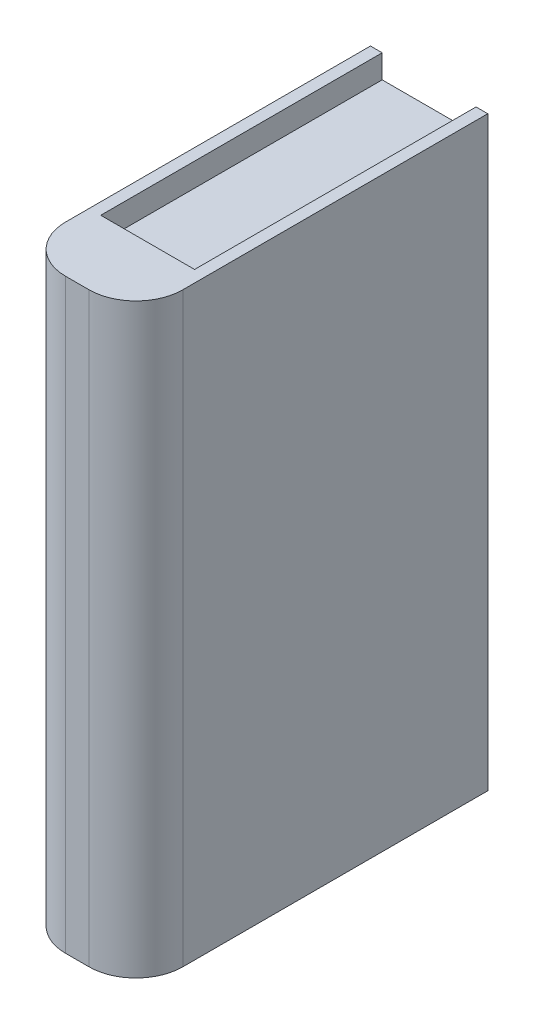
ISO-10303-21;
HEADER;
FILE_DESCRIPTION(('STEP AP214'),'2;1');
FILE_NAME('part.step','',(''),(''),'','','');
FILE_SCHEMA(('AUTOMOTIVE_DESIGN { 1 0 10303 214 1 1 1 1 }'));
ENDSEC;
DATA;
#1=APPLICATION_CONTEXT('core data for automotive mechanical design processes');
#2=APPLICATION_PROTOCOL_DEFINITION('international standard','automotive_design',2000,#1);
#3=PRODUCT_CONTEXT('',#1,'mechanical');
#4=PRODUCT('Part','Part','',(#3));
#5=PRODUCT_RELATED_PRODUCT_CATEGORY('part','',(#4));
#6=PRODUCT_DEFINITION_FORMATION('','',#4);
#7=PRODUCT_DEFINITION_CONTEXT('part definition',#1,'design');
#8=PRODUCT_DEFINITION('design','',#6,#7);
#9=PRODUCT_DEFINITION_SHAPE('','',#8);
#10=(LENGTH_UNIT() NAMED_UNIT(*) SI_UNIT(.MILLI.,.METRE.));
#11=(NAMED_UNIT(*) PLANE_ANGLE_UNIT() SI_UNIT($,.RADIAN.));
#12=(NAMED_UNIT(*) SI_UNIT($,.STERADIAN.) SOLID_ANGLE_UNIT());
#13=UNCERTAINTY_MEASURE_WITH_UNIT(LENGTH_MEASURE(1.E-05),#10,'distance_accuracy_value','');
#14=(GEOMETRIC_REPRESENTATION_CONTEXT(3) GLOBAL_UNCERTAINTY_ASSIGNED_CONTEXT((#13)) GLOBAL_UNIT_ASSIGNED_CONTEXT((#10,
#11,#12)) REPRESENTATION_CONTEXT('',''));
#15=CARTESIAN_POINT('',(0.,0.,0.));
#16=DIRECTION('',(0.,0.,1.));
#17=DIRECTION('',(1.,0.,0.));
#18=AXIS2_PLACEMENT_3D('',#15,#16,#17);
#19=CARTESIAN_POINT('',(5.,0.,0.));
#20=DIRECTION('',(0.,0.,1.));
#21=DIRECTION('',(1.,0.,0.));
#22=AXIS2_PLACEMENT_3D('',#19,#20,#21);
#23=PLANE('',#22);
#24=DIRECTION('',(-1.,0.,0.));
#25=VECTOR('',#24,1.);
#26=CARTESIAN_POINT('',(5.,25.,0.));
#27=LINE('',#26,#25);
#28=CARTESIAN_POINT('',(0.5,25.,0.));
#29=VERTEX_POINT('',#28);
#30=CARTESIAN_POINT('',(0.,25.,0.));
#31=VERTEX_POINT('',#30);
#32=EDGE_CURVE('E169',#29,#31,#27,.T.);
#33=ORIENTED_EDGE('',*,*,#32,.F.);
#34=DIRECTION('',(0.,1.,0.));
#35=VECTOR('',#34,1.);
#36=CARTESIAN_POINT('',(0.5,24.,0.));
#37=LINE('',#36,#35);
#38=CARTESIAN_POINT('',(0.5,24.,0.));
#39=VERTEX_POINT('',#38);
#40=EDGE_CURVE('E139',#39,#29,#37,.T.);
#41=ORIENTED_EDGE('',*,*,#40,.F.);
#42=DIRECTION('',(-1.,0.,0.));
#43=VECTOR('',#42,1.);
#44=CARTESIAN_POINT('',(0.5,24.,0.));
#45=LINE('',#44,#43);
#46=CARTESIAN_POINT('',(4.5,24.,0.));
#47=VERTEX_POINT('',#46);
#48=EDGE_CURVE('E117',#47,#39,#45,.T.);
#49=ORIENTED_EDGE('',*,*,#48,.F.);
#50=DIRECTION('',(0.,1.,0.));
#51=VECTOR('',#50,1.);
#52=CARTESIAN_POINT('',(4.5,24.,0.));
#53=LINE('',#52,#51);
#54=CARTESIAN_POINT('',(4.5,25.,0.));
#55=VERTEX_POINT('',#54);
#56=EDGE_CURVE('E142',#47,#55,#53,.T.);
#57=ORIENTED_EDGE('',*,*,#56,.T.);
#58=CARTESIAN_POINT('',(5.,25.,0.));
#59=VERTEX_POINT('',#58);
#60=EDGE_CURVE('E170',#59,#55,#27,.T.);
#61=ORIENTED_EDGE('',*,*,#60,.F.);
#62=DIRECTION('',(0.,1.,0.));
#63=VECTOR('',#62,1.);
#64=CARTESIAN_POINT('',(5.,0.,0.));
#65=LINE('',#64,#63);
#66=CARTESIAN_POINT('',(5.,0.,0.));
#67=VERTEX_POINT('',#66);
#68=EDGE_CURVE('E146',#67,#59,#65,.T.);
#69=ORIENTED_EDGE('',*,*,#68,.F.);
#70=DIRECTION('',(-1.,0.,0.));
#71=VECTOR('',#70,1.);
#72=CARTESIAN_POINT('',(5.,0.,0.));
#73=LINE('',#72,#71);
#74=CARTESIAN_POINT('',(0.,0.,0.));
#75=VERTEX_POINT('',#74);
#76=EDGE_CURVE('E155',#67,#75,#73,.T.);
#77=ORIENTED_EDGE('',*,*,#76,.T.);
#78=DIRECTION('',(0.,1.,0.));
#79=VECTOR('',#78,1.);
#80=CARTESIAN_POINT('',(0.,0.,0.));
#81=LINE('',#80,#79);
#82=EDGE_CURVE('E141',#75,#31,#81,.T.);
#83=ORIENTED_EDGE('',*,*,#82,.T.);
#84=EDGE_LOOP('',(#33,#41,#49,#57,#61,#69,#77,#83));
#85=FACE_BOUND('',#84,.T.);
#86=ADVANCED_FACE('F33',(#85),#23,.F.);
#87=CARTESIAN_POINT('',(5.,25.,0.));
#88=DIRECTION('',(0.,-1.,0.));
#89=DIRECTION('',(0.,0.,-1.));
#90=AXIS2_PLACEMENT_3D('',#87,#88,#89);
#91=PLANE('',#90);
#92=DIRECTION('',(1.,0.,0.));
#93=VECTOR('',#92,1.);
#94=CARTESIAN_POINT('',(0.500000000000002,25.,12.));
#95=LINE('',#94,#93);
#96=CARTESIAN_POINT('',(0.500000000000001,25.,12.));
#97=VERTEX_POINT('',#96);
#98=CARTESIAN_POINT('',(4.5,25.,12.));
#99=VERTEX_POINT('',#98);
#100=EDGE_CURVE('E132',#97,#99,#95,.T.);
#101=ORIENTED_EDGE('',*,*,#100,.F.);
#102=DIRECTION('',(0.,0.,1.));
#103=VECTOR('',#102,1.);
#104=CARTESIAN_POINT('',(0.5,25.,0.));
#105=LINE('',#104,#103);
#106=EDGE_CURVE('E48',#29,#97,#105,.T.);
#107=ORIENTED_EDGE('',*,*,#106,.F.);
#108=ORIENTED_EDGE('',*,*,#32,.T.);
#109=DIRECTION('',(0.,0.,1.));
#110=VECTOR('',#109,1.);
#111=CARTESIAN_POINT('',(0.,25.,0.));
#112=LINE('',#111,#110);
#113=CARTESIAN_POINT('',(0.,25.,13.));
#114=VERTEX_POINT('',#113);
#115=EDGE_CURVE('E158',#31,#114,#112,.T.);
#116=ORIENTED_EDGE('',*,*,#115,.T.);
#117=CARTESIAN_POINT('',(2.,25.,13.));
#118=DIRECTION('',(0.,-1.,0.));
#119=DIRECTION('',(0.,0.,-1.));
#120=AXIS2_PLACEMENT_3D('',#117,#118,#119);
#121=CIRCLE('',#120,2.);
#122=CARTESIAN_POINT('',(2.,25.,15.));
#123=VERTEX_POINT('',#122);
#124=EDGE_CURVE('E185',#114,#123,#121,.F.);
#125=ORIENTED_EDGE('',*,*,#124,.T.);
#126=DIRECTION('',(-1.,0.,0.));
#127=VECTOR('',#126,1.);
#128=CARTESIAN_POINT('',(5.,25.,15.));
#129=LINE('',#128,#127);
#130=CARTESIAN_POINT('',(3.,25.,15.));
#131=VERTEX_POINT('',#130);
#132=EDGE_CURVE('E166',#131,#123,#129,.T.);
#133=ORIENTED_EDGE('',*,*,#132,.F.);
#134=CARTESIAN_POINT('',(3.,25.,13.));
#135=DIRECTION('',(0.,-1.,0.));
#136=DIRECTION('',(0.,0.,-1.));
#137=AXIS2_PLACEMENT_3D('',#134,#135,#136);
#138=CIRCLE('',#137,2.);
#139=CARTESIAN_POINT('',(5.,25.,13.));
#140=VERTEX_POINT('',#139);
#141=EDGE_CURVE('E41',#131,#140,#138,.F.);
#142=ORIENTED_EDGE('',*,*,#141,.T.);
#143=DIRECTION('',(0.,0.,1.));
#144=VECTOR('',#143,1.);
#145=CARTESIAN_POINT('',(5.,25.,0.));
#146=LINE('',#145,#144);
#147=EDGE_CURVE('E149',#59,#140,#146,.T.);
#148=ORIENTED_EDGE('',*,*,#147,.F.);
#149=ORIENTED_EDGE('',*,*,#60,.T.);
#150=DIRECTION('',(0.,0.,-1.));
#151=VECTOR('',#150,1.);
#152=CARTESIAN_POINT('',(4.5,25.,0.));
#153=LINE('',#152,#151);
#154=EDGE_CURVE('E130',#99,#55,#153,.T.);
#155=ORIENTED_EDGE('',*,*,#154,.F.);
#156=EDGE_LOOP('',(#101,#107,#108,#116,#125,#133,#142,#148,#149,#155));
#157=FACE_BOUND('',#156,.T.);
#158=ADVANCED_FACE('F189',(#157),#91,.F.);
#159=CARTESIAN_POINT('',(5.,0.,15.));
#160=DIRECTION('',(0.,0.,-1.));
#161=DIRECTION('',(-1.,0.,0.));
#162=AXIS2_PLACEMENT_3D('',#159,#160,#161);
#163=PLANE('',#162);
#164=DIRECTION('',(-1.,0.,0.));
#165=VECTOR('',#164,1.);
#166=CARTESIAN_POINT('',(5.,0.,15.));
#167=LINE('',#166,#165);
#168=CARTESIAN_POINT('',(3.,0.,15.));
#169=VERTEX_POINT('',#168);
#170=CARTESIAN_POINT('',(2.,0.,15.));
#171=VERTEX_POINT('',#170);
#172=EDGE_CURVE('E163',#169,#171,#167,.T.);
#173=ORIENTED_EDGE('',*,*,#172,.F.);
#174=DIRECTION('',(0.,-1.,0.));
#175=VECTOR('',#174,1.);
#176=CARTESIAN_POINT('',(3.,25.,15.));
#177=LINE('',#176,#175);
#178=EDGE_CURVE('E183',#169,#131,#177,.F.);
#179=ORIENTED_EDGE('',*,*,#178,.T.);
#180=ORIENTED_EDGE('',*,*,#132,.T.);
#181=DIRECTION('',(0.,-1.,0.));
#182=VECTOR('',#181,1.);
#183=CARTESIAN_POINT('',(2.,0.,15.));
#184=LINE('',#183,#182);
#185=EDGE_CURVE('E180',#123,#171,#184,.T.);
#186=ORIENTED_EDGE('',*,*,#185,.T.);
#187=EDGE_LOOP('',(#173,#179,#180,#186));
#188=FACE_BOUND('',#187,.T.);
#189=ADVANCED_FACE('F204',(#188),#163,.F.);
#190=CARTESIAN_POINT('',(5.,0.,0.));
#191=DIRECTION('',(0.,1.,0.));
#192=DIRECTION('',(0.,0.,1.));
#193=AXIS2_PLACEMENT_3D('',#190,#191,#192);
#194=PLANE('',#193);
#195=DIRECTION('',(0.,0.,-1.));
#196=VECTOR('',#195,1.);
#197=CARTESIAN_POINT('',(5.,0.,0.));
#198=LINE('',#197,#196);
#199=CARTESIAN_POINT('',(5.,0.,13.));
#200=VERTEX_POINT('',#199);
#201=EDGE_CURVE('E153',#200,#67,#198,.T.);
#202=ORIENTED_EDGE('',*,*,#201,.F.);
#203=CARTESIAN_POINT('',(3.,0.,13.));
#204=DIRECTION('',(0.,1.,0.));
#205=DIRECTION('',(0.,0.,1.));
#206=AXIS2_PLACEMENT_3D('',#203,#204,#205);
#207=CIRCLE('',#206,2.);
#208=EDGE_CURVE('E178',#200,#169,#207,.F.);
#209=ORIENTED_EDGE('',*,*,#208,.T.);
#210=ORIENTED_EDGE('',*,*,#172,.T.);
#211=CARTESIAN_POINT('',(2.,0.,13.));
#212=DIRECTION('',(0.,1.,0.));
#213=DIRECTION('',(0.,0.,1.));
#214=AXIS2_PLACEMENT_3D('',#211,#212,#213);
#215=CIRCLE('',#214,2.);
#216=CARTESIAN_POINT('',(0.,0.,13.));
#217=VERTEX_POINT('',#216);
#218=EDGE_CURVE('E176',#171,#217,#215,.F.);
#219=ORIENTED_EDGE('',*,*,#218,.T.);
#220=DIRECTION('',(0.,0.,-1.));
#221=VECTOR('',#220,1.);
#222=CARTESIAN_POINT('',(0.,0.,0.));
#223=LINE('',#222,#221);
#224=EDGE_CURVE('E150',#217,#75,#223,.T.);
#225=ORIENTED_EDGE('',*,*,#224,.T.);
#226=ORIENTED_EDGE('',*,*,#76,.F.);
#227=EDGE_LOOP('',(#202,#209,#210,#219,#225,#226));
#228=FACE_BOUND('',#227,.T.);
#229=ADVANCED_FACE('F201',(#228),#194,.F.);
#230=CARTESIAN_POINT('',(5.,0.,0.));
#231=DIRECTION('',(1.,0.,0.));
#232=DIRECTION('',(0.,0.,-1.));
#233=AXIS2_PLACEMENT_3D('',#230,#231,#232);
#234=PLANE('',#233);
#235=ORIENTED_EDGE('',*,*,#147,.T.);
#236=DIRECTION('',(0.,-1.,0.));
#237=VECTOR('',#236,1.);
#238=CARTESIAN_POINT('',(5.,0.,13.));
#239=LINE('',#238,#237);
#240=EDGE_CURVE('E173',#140,#200,#239,.T.);
#241=ORIENTED_EDGE('',*,*,#240,.T.);
#242=ORIENTED_EDGE('',*,*,#201,.T.);
#243=ORIENTED_EDGE('',*,*,#68,.T.);
#244=EDGE_LOOP('',(#235,#241,#242,#243));
#245=FACE_BOUND('',#244,.T.);
#246=ADVANCED_FACE('F194',(#245),#234,.T.);
#247=CARTESIAN_POINT('',(0.,0.,0.));
#248=DIRECTION('',(1.,0.,0.));
#249=DIRECTION('',(0.,0.,-1.));
#250=AXIS2_PLACEMENT_3D('',#247,#248,#249);
#251=PLANE('',#250);
#252=ORIENTED_EDGE('',*,*,#224,.F.);
#253=DIRECTION('',(0.,-1.,0.));
#254=VECTOR('',#253,1.);
#255=CARTESIAN_POINT('',(0.,0.,13.));
#256=LINE('',#255,#254);
#257=EDGE_CURVE('E11',#217,#114,#256,.F.);
#258=ORIENTED_EDGE('',*,*,#257,.T.);
#259=ORIENTED_EDGE('',*,*,#115,.F.);
#260=ORIENTED_EDGE('',*,*,#82,.F.);
#261=EDGE_LOOP('',(#252,#258,#259,#260));
#262=FACE_BOUND('',#261,.T.);
#263=ADVANCED_FACE('F209',(#262),#251,.F.);
#264=CARTESIAN_POINT('',(3.,0.,13.));
#265=DIRECTION('',(0.,1.,0.));
#266=DIRECTION('',(0.,0.,1.));
#267=AXIS2_PLACEMENT_3D('',#264,#265,#266);
#268=CYLINDRICAL_SURFACE('',#267,2.);
#269=ORIENTED_EDGE('',*,*,#141,.F.);
#270=ORIENTED_EDGE('',*,*,#178,.F.);
#271=ORIENTED_EDGE('',*,*,#208,.F.);
#272=ORIENTED_EDGE('',*,*,#240,.F.);
#273=EDGE_LOOP('',(#269,#270,#271,#272));
#274=FACE_BOUND('',#273,.T.);
#275=ADVANCED_FACE('F198',(#274),#268,.T.);
#276=CARTESIAN_POINT('',(2.,0.,13.));
#277=DIRECTION('',(0.,-1.,0.));
#278=DIRECTION('',(0.,0.,-1.));
#279=AXIS2_PLACEMENT_3D('',#276,#277,#278);
#280=CYLINDRICAL_SURFACE('',#279,2.);
#281=ORIENTED_EDGE('',*,*,#124,.F.);
#282=ORIENTED_EDGE('',*,*,#257,.F.);
#283=ORIENTED_EDGE('',*,*,#218,.F.);
#284=ORIENTED_EDGE('',*,*,#185,.F.);
#285=EDGE_LOOP('',(#281,#282,#283,#284));
#286=FACE_BOUND('',#285,.T.);
#287=ADVANCED_FACE('F35',(#286),#280,.T.);
#288=CARTESIAN_POINT('',(0.5,24.,0.));
#289=DIRECTION('',(-1.,0.,0.));
#290=DIRECTION('',(0.,0.,1.));
#291=AXIS2_PLACEMENT_3D('',#288,#289,#290);
#292=PLANE('',#291);
#293=ORIENTED_EDGE('',*,*,#106,.T.);
#294=DIRECTION('',(0.,1.,0.));
#295=VECTOR('',#294,1.);
#296=CARTESIAN_POINT('',(0.500000000000002,24.,12.));
#297=LINE('',#296,#295);
#298=CARTESIAN_POINT('',(0.500000000000002,24.,12.));
#299=VERTEX_POINT('',#298);
#300=EDGE_CURVE('E107',#299,#97,#297,.T.);
#301=ORIENTED_EDGE('',*,*,#300,.F.);
#302=DIRECTION('',(0.,0.,1.));
#303=VECTOR('',#302,1.);
#304=CARTESIAN_POINT('',(0.5,24.,0.));
#305=LINE('',#304,#303);
#306=EDGE_CURVE('E111',#39,#299,#305,.T.);
#307=ORIENTED_EDGE('',*,*,#306,.F.);
#308=ORIENTED_EDGE('',*,*,#40,.T.);
#309=EDGE_LOOP('',(#293,#301,#307,#308));
#310=FACE_BOUND('',#309,.T.);
#311=ADVANCED_FACE('F109',(#310),#292,.F.);
#312=CARTESIAN_POINT('',(4.5,24.,0.));
#313=DIRECTION('',(1.,0.,0.));
#314=DIRECTION('',(0.,0.,-1.));
#315=AXIS2_PLACEMENT_3D('',#312,#313,#314);
#316=PLANE('',#315);
#317=ORIENTED_EDGE('',*,*,#154,.T.);
#318=ORIENTED_EDGE('',*,*,#56,.F.);
#319=DIRECTION('',(0.,0.,-1.));
#320=VECTOR('',#319,1.);
#321=CARTESIAN_POINT('',(4.5,24.,0.));
#322=LINE('',#321,#320);
#323=CARTESIAN_POINT('',(4.5,24.,12.));
#324=VERTEX_POINT('',#323);
#325=EDGE_CURVE('E125',#324,#47,#322,.T.);
#326=ORIENTED_EDGE('',*,*,#325,.F.);
#327=DIRECTION('',(0.,1.,0.));
#328=VECTOR('',#327,1.);
#329=CARTESIAN_POINT('',(4.5,24.,12.));
#330=LINE('',#329,#328);
#331=EDGE_CURVE('E116',#324,#99,#330,.T.);
#332=ORIENTED_EDGE('',*,*,#331,.T.);
#333=EDGE_LOOP('',(#317,#318,#326,#332));
#334=FACE_BOUND('',#333,.T.);
#335=ADVANCED_FACE('F214',(#334),#316,.F.);
#336=CARTESIAN_POINT('',(0.500000000000002,24.,12.));
#337=DIRECTION('',(0.,0.,1.));
#338=DIRECTION('',(0.,-1.,0.));
#339=AXIS2_PLACEMENT_3D('',#336,#337,#338);
#340=PLANE('',#339);
#341=ORIENTED_EDGE('',*,*,#100,.T.);
#342=ORIENTED_EDGE('',*,*,#331,.F.);
#343=DIRECTION('',(1.,0.,0.));
#344=VECTOR('',#343,1.);
#345=CARTESIAN_POINT('',(0.500000000000002,24.,12.));
#346=LINE('',#345,#344);
#347=EDGE_CURVE('E120',#299,#324,#346,.T.);
#348=ORIENTED_EDGE('',*,*,#347,.F.);
#349=ORIENTED_EDGE('',*,*,#300,.T.);
#350=EDGE_LOOP('',(#341,#342,#348,#349));
#351=FACE_BOUND('',#350,.T.);
#352=ADVANCED_FACE('F121',(#351),#340,.F.);
#353=CARTESIAN_POINT('',(0.,24.,0.));
#354=DIRECTION('',(0.,1.,0.));
#355=DIRECTION('',(0.,0.,1.));
#356=AXIS2_PLACEMENT_3D('',#353,#354,#355);
#357=PLANE('',#356);
#358=ORIENTED_EDGE('',*,*,#306,.T.);
#359=ORIENTED_EDGE('',*,*,#347,.T.);
#360=ORIENTED_EDGE('',*,*,#325,.T.);
#361=ORIENTED_EDGE('',*,*,#48,.T.);
#362=EDGE_LOOP('',(#358,#359,#360,#361));
#363=FACE_BOUND('',#362,.T.);
#364=ADVANCED_FACE('F127',(#363),#357,.T.);
#365=CLOSED_SHELL('',(#86,#158,#189,#229,#246,#263,#275,#287,#311,#335,#352,#364));
#366=MANIFOLD_SOLID_BREP('B2',#365);
#367=ADVANCED_BREP_SHAPE_REPRESENTATION('',(#18,#366),#14);
#368=SHAPE_DEFINITION_REPRESENTATION(#9,#367);
ENDSEC;
END-ISO-10303-21;
